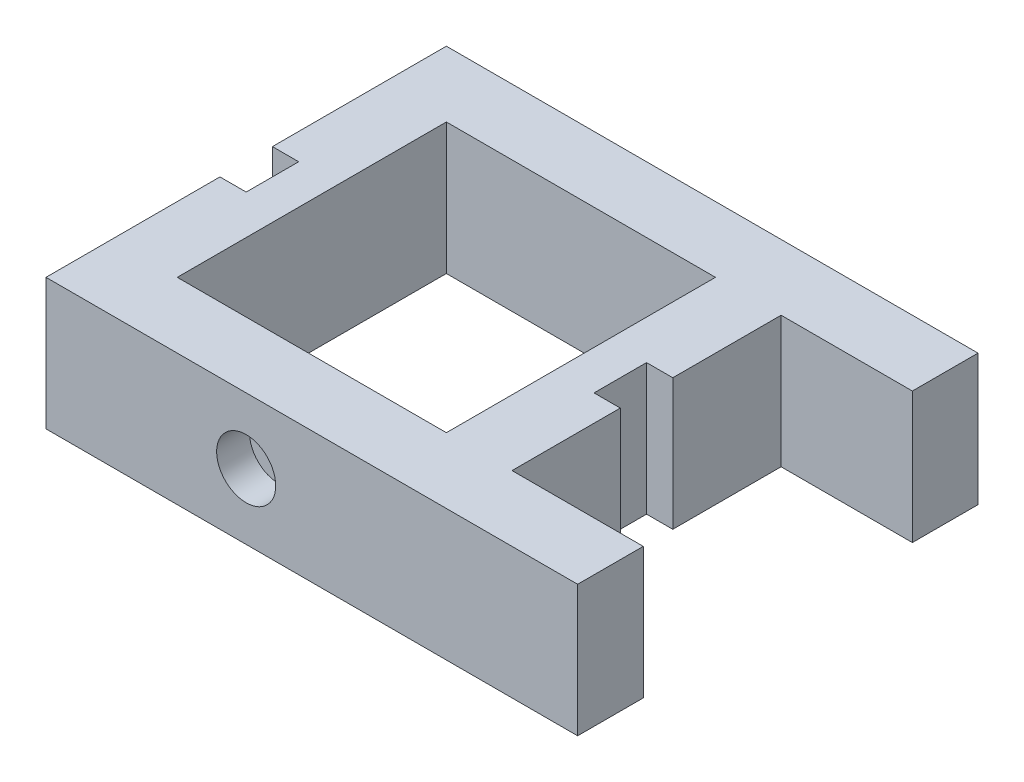
ISO-10303-21;
HEADER;
FILE_DESCRIPTION(('STEP AP214'),'2;1');
FILE_NAME('part.step','',(''),(''),'','','');
FILE_SCHEMA(('AUTOMOTIVE_DESIGN { 1 0 10303 214 1 1 1 1 }'));
ENDSEC;
DATA;
#1=APPLICATION_CONTEXT('core data for automotive mechanical design processes');
#2=APPLICATION_PROTOCOL_DEFINITION('international standard','automotive_design',2000,#1);
#3=PRODUCT_CONTEXT('',#1,'mechanical');
#4=PRODUCT('Part','Part','',(#3));
#5=PRODUCT_RELATED_PRODUCT_CATEGORY('part','',(#4));
#6=PRODUCT_DEFINITION_FORMATION('','',#4);
#7=PRODUCT_DEFINITION_CONTEXT('part definition',#1,'design');
#8=PRODUCT_DEFINITION('design','',#6,#7);
#9=PRODUCT_DEFINITION_SHAPE('','',#8);
#10=(LENGTH_UNIT() NAMED_UNIT(*) SI_UNIT(.MILLI.,.METRE.));
#11=(NAMED_UNIT(*) PLANE_ANGLE_UNIT() SI_UNIT($,.RADIAN.));
#12=(NAMED_UNIT(*) SI_UNIT($,.STERADIAN.) SOLID_ANGLE_UNIT());
#13=UNCERTAINTY_MEASURE_WITH_UNIT(LENGTH_MEASURE(1.E-05),#10,'distance_accuracy_value','');
#14=(GEOMETRIC_REPRESENTATION_CONTEXT(3) GLOBAL_UNCERTAINTY_ASSIGNED_CONTEXT((#13)) GLOBAL_UNIT_ASSIGNED_CONTEXT((#10,
#11,#12)) REPRESENTATION_CONTEXT('',''));
#15=CARTESIAN_POINT('',(0.,0.,0.));
#16=DIRECTION('',(0.,0.,1.));
#17=DIRECTION('',(1.,0.,0.));
#18=AXIS2_PLACEMENT_3D('',#15,#16,#17);
#19=CARTESIAN_POINT('',(-20.5,10.,-9.5));
#20=DIRECTION('',(0.,0.,1.));
#21=DIRECTION('',(1.,0.,0.));
#22=AXIS2_PLACEMENT_3D('',#19,#20,#21);
#23=CYLINDRICAL_SURFACE('',#22,2.5);
#24=CARTESIAN_POINT('',(-20.5,10.,20.5));
#25=DIRECTION('',(0.,0.,-1.));
#26=DIRECTION('',(-1.,0.,0.));
#27=AXIS2_PLACEMENT_3D('',#24,#25,#26);
#28=CIRCLE('',#27,2.5);
#29=CARTESIAN_POINT('',(-23.,10.,20.5));
#30=VERTEX_POINT('',#29);
#31=EDGE_CURVE('E207',#30,#30,#28,.T.);
#32=ORIENTED_EDGE('',*,*,#31,.T.);
#33=EDGE_LOOP('',(#32));
#34=FACE_BOUND('',#33,.T.);
#35=CARTESIAN_POINT('',(-20.5,10.,25.5));
#36=DIRECTION('',(0.,0.,1.));
#37=DIRECTION('',(1.,0.,0.));
#38=AXIS2_PLACEMENT_3D('',#35,#36,#37);
#39=CIRCLE('',#38,2.5);
#40=CARTESIAN_POINT('',(-18.,10.,25.5));
#41=VERTEX_POINT('',#40);
#42=EDGE_CURVE('E43',#41,#41,#39,.F.);
#43=ORIENTED_EDGE('',*,*,#42,.F.);
#44=EDGE_LOOP('',(#43));
#45=FACE_BOUND('',#44,.T.);
#46=ADVANCED_FACE('F39',(#34,#45),#23,.F.);
#47=CARTESIAN_POINT('',(0.,20.,0.));
#48=DIRECTION('',(0.,-1.,0.));
#49=DIRECTION('',(0.,0.,-1.));
#50=AXIS2_PLACEMENT_3D('',#47,#48,#49);
#51=PLANE('',#50);
#52=DIRECTION('',(0.,0.,1.));
#53=VECTOR('',#52,1.);
#54=CARTESIAN_POINT('',(-51.,20.,-30.5));
#55=LINE('',#54,#53);
#56=CARTESIAN_POINT('',(-51.,20.,-30.5));
#57=VERTEX_POINT('',#56);
#58=CARTESIAN_POINT('',(-51.,20.,-4.));
#59=VERTEX_POINT('',#58);
#60=EDGE_CURVE('E217',#57,#59,#55,.T.);
#61=ORIENTED_EDGE('',*,*,#60,.T.);
#62=DIRECTION('',(1.,0.,0.));
#63=VECTOR('',#62,1.);
#64=CARTESIAN_POINT('',(-47.,20.,-4.));
#65=LINE('',#64,#63);
#66=CARTESIAN_POINT('',(-47.,20.,-4.));
#67=VERTEX_POINT('',#66);
#68=EDGE_CURVE('E220',#59,#67,#65,.T.);
#69=ORIENTED_EDGE('',*,*,#68,.T.);
#70=DIRECTION('',(0.,0.,1.));
#71=VECTOR('',#70,1.);
#72=CARTESIAN_POINT('',(-47.,20.,-4.));
#73=LINE('',#72,#71);
#74=CARTESIAN_POINT('',(-47.,20.,4.));
#75=VERTEX_POINT('',#74);
#76=EDGE_CURVE('E223',#67,#75,#73,.T.);
#77=ORIENTED_EDGE('',*,*,#76,.T.);
#78=DIRECTION('',(-1.,0.,0.));
#79=VECTOR('',#78,1.);
#80=CARTESIAN_POINT('',(-47.,20.,4.));
#81=LINE('',#80,#79);
#82=CARTESIAN_POINT('',(-51.,20.,4.));
#83=VERTEX_POINT('',#82);
#84=EDGE_CURVE('E225',#75,#83,#81,.T.);
#85=ORIENTED_EDGE('',*,*,#84,.T.);
#86=DIRECTION('',(0.,0.,1.));
#87=VECTOR('',#86,1.);
#88=CARTESIAN_POINT('',(-51.,20.,4.));
#89=LINE('',#88,#87);
#90=CARTESIAN_POINT('',(-51.,20.,30.5));
#91=VERTEX_POINT('',#90);
#92=EDGE_CURVE('E227',#83,#91,#89,.T.);
#93=ORIENTED_EDGE('',*,*,#92,.T.);
#94=DIRECTION('',(1.,0.,0.));
#95=VECTOR('',#94,1.);
#96=CARTESIAN_POINT('',(-51.,20.,30.5));
#97=LINE('',#96,#95);
#98=CARTESIAN_POINT('',(30.,20.,30.5));
#99=VERTEX_POINT('',#98);
#100=EDGE_CURVE('E229',#91,#99,#97,.T.);
#101=ORIENTED_EDGE('',*,*,#100,.T.);
#102=DIRECTION('',(0.,0.,-1.));
#103=VECTOR('',#102,1.);
#104=CARTESIAN_POINT('',(30.,20.,20.5));
#105=LINE('',#104,#103);
#106=CARTESIAN_POINT('',(30.,20.,20.5));
#107=VERTEX_POINT('',#106);
#108=EDGE_CURVE('E231',#99,#107,#105,.T.);
#109=ORIENTED_EDGE('',*,*,#108,.T.);
#110=DIRECTION('',(-1.,0.,0.));
#111=VECTOR('',#110,1.);
#112=CARTESIAN_POINT('',(10.,20.,20.5));
#113=LINE('',#112,#111);
#114=CARTESIAN_POINT('',(10.,20.,20.5));
#115=VERTEX_POINT('',#114);
#116=EDGE_CURVE('E233',#107,#115,#113,.T.);
#117=ORIENTED_EDGE('',*,*,#116,.T.);
#118=DIRECTION('',(0.,0.,-1.));
#119=VECTOR('',#118,1.);
#120=CARTESIAN_POINT('',(10.,20.,4.));
#121=LINE('',#120,#119);
#122=CARTESIAN_POINT('',(10.,20.,4.));
#123=VERTEX_POINT('',#122);
#124=EDGE_CURVE('E235',#115,#123,#121,.T.);
#125=ORIENTED_EDGE('',*,*,#124,.T.);
#126=DIRECTION('',(-1.,0.,0.));
#127=VECTOR('',#126,1.);
#128=CARTESIAN_POINT('',(6.,20.,4.));
#129=LINE('',#128,#127);
#130=CARTESIAN_POINT('',(6.,20.,4.));
#131=VERTEX_POINT('',#130);
#132=EDGE_CURVE('E237',#123,#131,#129,.T.);
#133=ORIENTED_EDGE('',*,*,#132,.T.);
#134=DIRECTION('',(0.,0.,-1.));
#135=VECTOR('',#134,1.);
#136=CARTESIAN_POINT('',(6.,20.,-4.));
#137=LINE('',#136,#135);
#138=CARTESIAN_POINT('',(6.,20.,-4.));
#139=VERTEX_POINT('',#138);
#140=EDGE_CURVE('E239',#131,#139,#137,.T.);
#141=ORIENTED_EDGE('',*,*,#140,.T.);
#142=DIRECTION('',(1.,0.,0.));
#143=VECTOR('',#142,1.);
#144=CARTESIAN_POINT('',(6.,20.,-4.));
#145=LINE('',#144,#143);
#146=CARTESIAN_POINT('',(10.,20.,-4.));
#147=VERTEX_POINT('',#146);
#148=EDGE_CURVE('E241',#139,#147,#145,.T.);
#149=ORIENTED_EDGE('',*,*,#148,.T.);
#150=DIRECTION('',(0.,0.,-1.));
#151=VECTOR('',#150,1.);
#152=CARTESIAN_POINT('',(10.,20.,-20.5));
#153=LINE('',#152,#151);
#154=CARTESIAN_POINT('',(10.,20.,-20.5));
#155=VERTEX_POINT('',#154);
#156=EDGE_CURVE('E243',#147,#155,#153,.T.);
#157=ORIENTED_EDGE('',*,*,#156,.T.);
#158=DIRECTION('',(1.,0.,0.));
#159=VECTOR('',#158,1.);
#160=CARTESIAN_POINT('',(10.,20.,-20.5));
#161=LINE('',#160,#159);
#162=CARTESIAN_POINT('',(30.,20.,-20.5));
#163=VERTEX_POINT('',#162);
#164=EDGE_CURVE('E245',#155,#163,#161,.T.);
#165=ORIENTED_EDGE('',*,*,#164,.T.);
#166=DIRECTION('',(0.,0.,-1.));
#167=VECTOR('',#166,1.);
#168=CARTESIAN_POINT('',(30.,20.,-30.5));
#169=LINE('',#168,#167);
#170=CARTESIAN_POINT('',(30.,20.,-30.5));
#171=VERTEX_POINT('',#170);
#172=EDGE_CURVE('E247',#163,#171,#169,.T.);
#173=ORIENTED_EDGE('',*,*,#172,.T.);
#174=DIRECTION('',(-1.,0.,0.));
#175=VECTOR('',#174,1.);
#176=CARTESIAN_POINT('',(10.,20.,-30.5));
#177=LINE('',#176,#175);
#178=EDGE_CURVE('E249',#171,#57,#177,.T.);
#179=ORIENTED_EDGE('',*,*,#178,.T.);
#180=EDGE_LOOP('',(#61,#69,#77,#85,#93,#101,#109,#117,#125,#133,#141,#149,#157,#165,#173,#179));
#181=FACE_BOUND('',#180,.T.);
#182=DIRECTION('',(0.,0.,1.));
#183=VECTOR('',#182,1.);
#184=CARTESIAN_POINT('',(-41.,20.,-20.5));
#185=LINE('',#184,#183);
#186=CARTESIAN_POINT('',(-41.,20.,-20.5));
#187=VERTEX_POINT('',#186);
#188=CARTESIAN_POINT('',(-41.,20.,20.5));
#189=VERTEX_POINT('',#188);
#190=EDGE_CURVE('E178',#187,#189,#185,.T.);
#191=ORIENTED_EDGE('',*,*,#190,.F.);
#192=DIRECTION('',(-1.,0.,0.));
#193=VECTOR('',#192,1.);
#194=CARTESIAN_POINT('',(-41.,20.,-20.5));
#195=LINE('',#194,#193);
#196=CARTESIAN_POINT('',(0.,20.,-20.5));
#197=VERTEX_POINT('',#196);
#198=EDGE_CURVE('E201',#197,#187,#195,.T.);
#199=ORIENTED_EDGE('',*,*,#198,.F.);
#200=DIRECTION('',(0.,0.,-1.));
#201=VECTOR('',#200,1.);
#202=CARTESIAN_POINT('',(0.,20.,-20.5));
#203=LINE('',#202,#201);
#204=CARTESIAN_POINT('',(0.,20.,20.5));
#205=VERTEX_POINT('',#204);
#206=EDGE_CURVE('E199',#205,#197,#203,.T.);
#207=ORIENTED_EDGE('',*,*,#206,.F.);
#208=DIRECTION('',(1.,0.,0.));
#209=VECTOR('',#208,1.);
#210=CARTESIAN_POINT('',(-41.,20.,20.5));
#211=LINE('',#210,#209);
#212=EDGE_CURVE('E186',#189,#205,#211,.T.);
#213=ORIENTED_EDGE('',*,*,#212,.F.);
#214=EDGE_LOOP('',(#191,#199,#207,#213));
#215=FACE_BOUND('',#214,.T.);
#216=ADVANCED_FACE('F198',(#181,#215),#51,.F.);
#217=CARTESIAN_POINT('',(0.,0.,0.));
#218=DIRECTION('',(0.,-1.,0.));
#219=DIRECTION('',(0.,0.,-1.));
#220=AXIS2_PLACEMENT_3D('',#217,#218,#219);
#221=PLANE('',#220);
#222=DIRECTION('',(0.,0.,1.));
#223=VECTOR('',#222,1.);
#224=CARTESIAN_POINT('',(-51.,0.,-30.5));
#225=LINE('',#224,#223);
#226=CARTESIAN_POINT('',(-51.,0.,-30.5));
#227=VERTEX_POINT('',#226);
#228=CARTESIAN_POINT('',(-51.,0.,-4.));
#229=VERTEX_POINT('',#228);
#230=EDGE_CURVE('E194',#227,#229,#225,.T.);
#231=ORIENTED_EDGE('',*,*,#230,.F.);
#232=DIRECTION('',(-1.,0.,0.));
#233=VECTOR('',#232,1.);
#234=CARTESIAN_POINT('',(-51.,0.,-30.5));
#235=LINE('',#234,#233);
#236=CARTESIAN_POINT('',(30.,0.,-30.5));
#237=VERTEX_POINT('',#236);
#238=EDGE_CURVE('E221',#237,#227,#235,.T.);
#239=ORIENTED_EDGE('',*,*,#238,.F.);
#240=DIRECTION('',(0.,0.,-1.));
#241=VECTOR('',#240,1.);
#242=CARTESIAN_POINT('',(30.,0.,-30.5));
#243=LINE('',#242,#241);
#244=CARTESIAN_POINT('',(30.,0.,-20.5));
#245=VERTEX_POINT('',#244);
#246=EDGE_CURVE('E281',#245,#237,#243,.T.);
#247=ORIENTED_EDGE('',*,*,#246,.F.);
#248=DIRECTION('',(1.,0.,0.));
#249=VECTOR('',#248,1.);
#250=CARTESIAN_POINT('',(10.,0.,-20.5));
#251=LINE('',#250,#249);
#252=CARTESIAN_POINT('',(10.,0.,-20.5));
#253=VERTEX_POINT('',#252);
#254=EDGE_CURVE('E279',#253,#245,#251,.T.);
#255=ORIENTED_EDGE('',*,*,#254,.F.);
#256=DIRECTION('',(0.,0.,-1.));
#257=VECTOR('',#256,1.);
#258=CARTESIAN_POINT('',(10.,0.,-20.5));
#259=LINE('',#258,#257);
#260=CARTESIAN_POINT('',(10.,0.,-4.));
#261=VERTEX_POINT('',#260);
#262=EDGE_CURVE('E277',#261,#253,#259,.T.);
#263=ORIENTED_EDGE('',*,*,#262,.F.);
#264=DIRECTION('',(1.,0.,0.));
#265=VECTOR('',#264,1.);
#266=CARTESIAN_POINT('',(6.,0.,-4.));
#267=LINE('',#266,#265);
#268=CARTESIAN_POINT('',(6.,0.,-4.));
#269=VERTEX_POINT('',#268);
#270=EDGE_CURVE('E275',#269,#261,#267,.T.);
#271=ORIENTED_EDGE('',*,*,#270,.F.);
#272=DIRECTION('',(0.,0.,-1.));
#273=VECTOR('',#272,1.);
#274=CARTESIAN_POINT('',(6.,0.,-4.));
#275=LINE('',#274,#273);
#276=CARTESIAN_POINT('',(6.,0.,4.));
#277=VERTEX_POINT('',#276);
#278=EDGE_CURVE('E273',#277,#269,#275,.T.);
#279=ORIENTED_EDGE('',*,*,#278,.F.);
#280=DIRECTION('',(-1.,0.,0.));
#281=VECTOR('',#280,1.);
#282=CARTESIAN_POINT('',(6.,0.,4.));
#283=LINE('',#282,#281);
#284=CARTESIAN_POINT('',(10.,0.,4.));
#285=VERTEX_POINT('',#284);
#286=EDGE_CURVE('E271',#285,#277,#283,.T.);
#287=ORIENTED_EDGE('',*,*,#286,.F.);
#288=DIRECTION('',(0.,0.,-1.));
#289=VECTOR('',#288,1.);
#290=CARTESIAN_POINT('',(10.,0.,4.));
#291=LINE('',#290,#289);
#292=CARTESIAN_POINT('',(10.,0.,20.5));
#293=VERTEX_POINT('',#292);
#294=EDGE_CURVE('E269',#293,#285,#291,.T.);
#295=ORIENTED_EDGE('',*,*,#294,.F.);
#296=DIRECTION('',(-1.,0.,0.));
#297=VECTOR('',#296,1.);
#298=CARTESIAN_POINT('',(10.,0.,20.5));
#299=LINE('',#298,#297);
#300=CARTESIAN_POINT('',(30.,0.,20.5));
#301=VERTEX_POINT('',#300);
#302=EDGE_CURVE('E267',#301,#293,#299,.T.);
#303=ORIENTED_EDGE('',*,*,#302,.F.);
#304=DIRECTION('',(0.,0.,-1.));
#305=VECTOR('',#304,1.);
#306=CARTESIAN_POINT('',(30.,0.,20.5));
#307=LINE('',#306,#305);
#308=CARTESIAN_POINT('',(30.,0.,30.5));
#309=VERTEX_POINT('',#308);
#310=EDGE_CURVE('E265',#309,#301,#307,.T.);
#311=ORIENTED_EDGE('',*,*,#310,.F.);
#312=DIRECTION('',(1.,0.,0.));
#313=VECTOR('',#312,1.);
#314=CARTESIAN_POINT('',(10.,0.,30.5));
#315=LINE('',#314,#313);
#316=CARTESIAN_POINT('',(-51.,0.,30.5));
#317=VERTEX_POINT('',#316);
#318=EDGE_CURVE('E263',#317,#309,#315,.T.);
#319=ORIENTED_EDGE('',*,*,#318,.F.);
#320=DIRECTION('',(0.,0.,1.));
#321=VECTOR('',#320,1.);
#322=CARTESIAN_POINT('',(-51.,0.,4.));
#323=LINE('',#322,#321);
#324=CARTESIAN_POINT('',(-51.,0.,4.));
#325=VERTEX_POINT('',#324);
#326=EDGE_CURVE('E260',#325,#317,#323,.T.);
#327=ORIENTED_EDGE('',*,*,#326,.F.);
#328=DIRECTION('',(-1.,0.,0.));
#329=VECTOR('',#328,1.);
#330=CARTESIAN_POINT('',(-47.,0.,4.));
#331=LINE('',#330,#329);
#332=CARTESIAN_POINT('',(-47.,0.,4.));
#333=VERTEX_POINT('',#332);
#334=EDGE_CURVE('E258',#333,#325,#331,.T.);
#335=ORIENTED_EDGE('',*,*,#334,.F.);
#336=DIRECTION('',(0.,0.,1.));
#337=VECTOR('',#336,1.);
#338=CARTESIAN_POINT('',(-47.,0.,-4.));
#339=LINE('',#338,#337);
#340=CARTESIAN_POINT('',(-47.,0.,-4.));
#341=VERTEX_POINT('',#340);
#342=EDGE_CURVE('E256',#341,#333,#339,.T.);
#343=ORIENTED_EDGE('',*,*,#342,.F.);
#344=DIRECTION('',(1.,0.,0.));
#345=VECTOR('',#344,1.);
#346=CARTESIAN_POINT('',(-47.,0.,-4.));
#347=LINE('',#346,#345);
#348=EDGE_CURVE('E254',#229,#341,#347,.T.);
#349=ORIENTED_EDGE('',*,*,#348,.F.);
#350=EDGE_LOOP('',(#231,#239,#247,#255,#263,#271,#279,#287,#295,#303,#311,#319,#327,#335,#343,#349));
#351=FACE_BOUND('',#350,.T.);
#352=DIRECTION('',(-1.,0.,0.));
#353=VECTOR('',#352,1.);
#354=CARTESIAN_POINT('',(-41.,0.,-20.5));
#355=LINE('',#354,#353);
#356=CARTESIAN_POINT('',(0.,0.,-20.5));
#357=VERTEX_POINT('',#356);
#358=CARTESIAN_POINT('',(-41.,0.,-20.5));
#359=VERTEX_POINT('',#358);
#360=EDGE_CURVE('E187',#357,#359,#355,.T.);
#361=ORIENTED_EDGE('',*,*,#360,.T.);
#362=DIRECTION('',(0.,0.,1.));
#363=VECTOR('',#362,1.);
#364=CARTESIAN_POINT('',(-41.,0.,-20.5));
#365=LINE('',#364,#363);
#366=CARTESIAN_POINT('',(-41.,0.,20.5));
#367=VERTEX_POINT('',#366);
#368=EDGE_CURVE('E64',#359,#367,#365,.T.);
#369=ORIENTED_EDGE('',*,*,#368,.T.);
#370=DIRECTION('',(1.,0.,0.));
#371=VECTOR('',#370,1.);
#372=CARTESIAN_POINT('',(-41.,0.,20.5));
#373=LINE('',#372,#371);
#374=CARTESIAN_POINT('',(0.,0.,20.5));
#375=VERTEX_POINT('',#374);
#376=EDGE_CURVE('E193',#367,#375,#373,.T.);
#377=ORIENTED_EDGE('',*,*,#376,.T.);
#378=DIRECTION('',(0.,0.,-1.));
#379=VECTOR('',#378,1.);
#380=CARTESIAN_POINT('',(0.,0.,-20.5));
#381=LINE('',#380,#379);
#382=EDGE_CURVE('E209',#375,#357,#381,.T.);
#383=ORIENTED_EDGE('',*,*,#382,.T.);
#384=EDGE_LOOP('',(#361,#369,#377,#383));
#385=FACE_BOUND('',#384,.T.);
#386=ADVANCED_FACE('F361',(#351,#385),#221,.T.);
#387=CARTESIAN_POINT('',(-51.,20.,-30.5));
#388=DIRECTION('',(1.,0.,0.));
#389=DIRECTION('',(0.,0.,-1.));
#390=AXIS2_PLACEMENT_3D('',#387,#388,#389);
#391=PLANE('',#390);
#392=ORIENTED_EDGE('',*,*,#230,.T.);
#393=DIRECTION('',(0.,-1.,0.));
#394=VECTOR('',#393,1.);
#395=CARTESIAN_POINT('',(-51.,20.,-4.));
#396=LINE('',#395,#394);
#397=EDGE_CURVE('E11',#59,#229,#396,.T.);
#398=ORIENTED_EDGE('',*,*,#397,.F.);
#399=ORIENTED_EDGE('',*,*,#60,.F.);
#400=DIRECTION('',(0.,-1.,0.));
#401=VECTOR('',#400,1.);
#402=CARTESIAN_POINT('',(-51.,20.,-30.5));
#403=LINE('',#402,#401);
#404=EDGE_CURVE('E251',#57,#227,#403,.T.);
#405=ORIENTED_EDGE('',*,*,#404,.T.);
#406=EDGE_LOOP('',(#392,#398,#399,#405));
#407=FACE_BOUND('',#406,.T.);
#408=ADVANCED_FACE('F41',(#407),#391,.F.);
#409=CARTESIAN_POINT('',(-47.,20.,-4.));
#410=DIRECTION('',(0.,0.,-1.));
#411=DIRECTION('',(-1.,0.,0.));
#412=AXIS2_PLACEMENT_3D('',#409,#410,#411);
#413=PLANE('',#412);
#414=ORIENTED_EDGE('',*,*,#348,.T.);
#415=DIRECTION('',(0.,-1.,0.));
#416=VECTOR('',#415,1.);
#417=CARTESIAN_POINT('',(-47.,20.,-4.));
#418=LINE('',#417,#416);
#419=EDGE_CURVE('E48',#67,#341,#418,.T.);
#420=ORIENTED_EDGE('',*,*,#419,.F.);
#421=ORIENTED_EDGE('',*,*,#68,.F.);
#422=ORIENTED_EDGE('',*,*,#397,.T.);
#423=EDGE_LOOP('',(#414,#420,#421,#422));
#424=FACE_BOUND('',#423,.T.);
#425=ADVANCED_FACE('F390',(#424),#413,.F.);
#426=CARTESIAN_POINT('',(-47.,20.,-4.));
#427=DIRECTION('',(1.,0.,0.));
#428=DIRECTION('',(0.,0.,-1.));
#429=AXIS2_PLACEMENT_3D('',#426,#427,#428);
#430=PLANE('',#429);
#431=ORIENTED_EDGE('',*,*,#342,.T.);
#432=DIRECTION('',(0.,-1.,0.));
#433=VECTOR('',#432,1.);
#434=CARTESIAN_POINT('',(-47.,20.,4.));
#435=LINE('',#434,#433);
#436=EDGE_CURVE('E323',#75,#333,#435,.T.);
#437=ORIENTED_EDGE('',*,*,#436,.F.);
#438=ORIENTED_EDGE('',*,*,#76,.F.);
#439=ORIENTED_EDGE('',*,*,#419,.T.);
#440=EDGE_LOOP('',(#431,#437,#438,#439));
#441=FACE_BOUND('',#440,.T.);
#442=ADVANCED_FACE('F387',(#441),#430,.F.);
#443=CARTESIAN_POINT('',(-47.,20.,4.));
#444=DIRECTION('',(0.,0.,1.));
#445=DIRECTION('',(1.,0.,0.));
#446=AXIS2_PLACEMENT_3D('',#443,#444,#445);
#447=PLANE('',#446);
#448=ORIENTED_EDGE('',*,*,#334,.T.);
#449=DIRECTION('',(0.,-1.,0.));
#450=VECTOR('',#449,1.);
#451=CARTESIAN_POINT('',(-51.,20.,4.));
#452=LINE('',#451,#450);
#453=EDGE_CURVE('E320',#83,#325,#452,.T.);
#454=ORIENTED_EDGE('',*,*,#453,.F.);
#455=ORIENTED_EDGE('',*,*,#84,.F.);
#456=ORIENTED_EDGE('',*,*,#436,.T.);
#457=EDGE_LOOP('',(#448,#454,#455,#456));
#458=FACE_BOUND('',#457,.T.);
#459=ADVANCED_FACE('F383',(#458),#447,.F.);
#460=CARTESIAN_POINT('',(-51.,20.,4.));
#461=DIRECTION('',(1.,0.,0.));
#462=DIRECTION('',(0.,0.,-1.));
#463=AXIS2_PLACEMENT_3D('',#460,#461,#462);
#464=PLANE('',#463);
#465=ORIENTED_EDGE('',*,*,#326,.T.);
#466=DIRECTION('',(0.,-1.,0.));
#467=VECTOR('',#466,1.);
#468=CARTESIAN_POINT('',(-51.,20.,30.5));
#469=LINE('',#468,#467);
#470=EDGE_CURVE('E317',#91,#317,#469,.T.);
#471=ORIENTED_EDGE('',*,*,#470,.F.);
#472=ORIENTED_EDGE('',*,*,#92,.F.);
#473=ORIENTED_EDGE('',*,*,#453,.T.);
#474=EDGE_LOOP('',(#465,#471,#472,#473));
#475=FACE_BOUND('',#474,.T.);
#476=ADVANCED_FACE('F348',(#475),#464,.F.);
#477=CARTESIAN_POINT('',(10.,20.,30.5));
#478=DIRECTION('',(0.,0.,-1.));
#479=DIRECTION('',(-1.,0.,0.));
#480=AXIS2_PLACEMENT_3D('',#477,#478,#479);
#481=PLANE('',#480);
#482=CARTESIAN_POINT('',(-20.5,10.,30.5));
#483=DIRECTION('',(0.,0.,1.));
#484=DIRECTION('',(1.,0.,0.));
#485=AXIS2_PLACEMENT_3D('',#482,#483,#484);
#486=CIRCLE('',#485,4.5);
#487=CARTESIAN_POINT('',(-16.,10.,30.5));
#488=VERTEX_POINT('',#487);
#489=EDGE_CURVE('E335',#488,#488,#486,.T.);
#490=ORIENTED_EDGE('',*,*,#489,.F.);
#491=EDGE_LOOP('',(#490));
#492=FACE_BOUND('',#491,.T.);
#493=ORIENTED_EDGE('',*,*,#318,.T.);
#494=DIRECTION('',(0.,-1.,0.));
#495=VECTOR('',#494,1.);
#496=CARTESIAN_POINT('',(30.,20.,30.5));
#497=LINE('',#496,#495);
#498=EDGE_CURVE('E314',#99,#309,#497,.T.);
#499=ORIENTED_EDGE('',*,*,#498,.F.);
#500=ORIENTED_EDGE('',*,*,#100,.F.);
#501=ORIENTED_EDGE('',*,*,#470,.T.);
#502=EDGE_LOOP('',(#493,#499,#500,#501));
#503=FACE_BOUND('',#502,.T.);
#504=ADVANCED_FACE('F344',(#492,#503),#481,.F.);
#505=CARTESIAN_POINT('',(30.,20.,20.5));
#506=DIRECTION('',(-1.,0.,0.));
#507=DIRECTION('',(0.,0.,1.));
#508=AXIS2_PLACEMENT_3D('',#505,#506,#507);
#509=PLANE('',#508);
#510=ORIENTED_EDGE('',*,*,#310,.T.);
#511=DIRECTION('',(0.,-1.,0.));
#512=VECTOR('',#511,1.);
#513=CARTESIAN_POINT('',(30.,20.,20.5));
#514=LINE('',#513,#512);
#515=EDGE_CURVE('E311',#107,#301,#514,.T.);
#516=ORIENTED_EDGE('',*,*,#515,.F.);
#517=ORIENTED_EDGE('',*,*,#108,.F.);
#518=ORIENTED_EDGE('',*,*,#498,.T.);
#519=EDGE_LOOP('',(#510,#516,#517,#518));
#520=FACE_BOUND('',#519,.T.);
#521=ADVANCED_FACE('F347',(#520),#509,.F.);
#522=CARTESIAN_POINT('',(10.,20.,20.5));
#523=DIRECTION('',(0.,0.,1.));
#524=DIRECTION('',(1.,0.,0.));
#525=AXIS2_PLACEMENT_3D('',#522,#523,#524);
#526=PLANE('',#525);
#527=ORIENTED_EDGE('',*,*,#302,.T.);
#528=DIRECTION('',(0.,-1.,0.));
#529=VECTOR('',#528,1.);
#530=CARTESIAN_POINT('',(10.,20.,20.5));
#531=LINE('',#530,#529);
#532=EDGE_CURVE('E308',#115,#293,#531,.T.);
#533=ORIENTED_EDGE('',*,*,#532,.F.);
#534=ORIENTED_EDGE('',*,*,#116,.F.);
#535=ORIENTED_EDGE('',*,*,#515,.T.);
#536=EDGE_LOOP('',(#527,#533,#534,#535));
#537=FACE_BOUND('',#536,.T.);
#538=ADVANCED_FACE('F367',(#537),#526,.F.);
#539=CARTESIAN_POINT('',(10.,20.,4.));
#540=DIRECTION('',(-1.,0.,0.));
#541=DIRECTION('',(0.,0.,1.));
#542=AXIS2_PLACEMENT_3D('',#539,#540,#541);
#543=PLANE('',#542);
#544=ORIENTED_EDGE('',*,*,#294,.T.);
#545=DIRECTION('',(0.,-1.,0.));
#546=VECTOR('',#545,1.);
#547=CARTESIAN_POINT('',(10.,20.,4.));
#548=LINE('',#547,#546);
#549=EDGE_CURVE('E305',#123,#285,#548,.T.);
#550=ORIENTED_EDGE('',*,*,#549,.F.);
#551=ORIENTED_EDGE('',*,*,#124,.F.);
#552=ORIENTED_EDGE('',*,*,#532,.T.);
#553=EDGE_LOOP('',(#544,#550,#551,#552));
#554=FACE_BOUND('',#553,.T.);
#555=ADVANCED_FACE('F371',(#554),#543,.F.);
#556=CARTESIAN_POINT('',(6.,20.,4.));
#557=DIRECTION('',(0.,0.,1.));
#558=DIRECTION('',(1.,0.,0.));
#559=AXIS2_PLACEMENT_3D('',#556,#557,#558);
#560=PLANE('',#559);
#561=ORIENTED_EDGE('',*,*,#286,.T.);
#562=DIRECTION('',(0.,-1.,0.));
#563=VECTOR('',#562,1.);
#564=CARTESIAN_POINT('',(6.,20.,4.));
#565=LINE('',#564,#563);
#566=EDGE_CURVE('E302',#131,#277,#565,.T.);
#567=ORIENTED_EDGE('',*,*,#566,.F.);
#568=ORIENTED_EDGE('',*,*,#132,.F.);
#569=ORIENTED_EDGE('',*,*,#549,.T.);
#570=EDGE_LOOP('',(#561,#567,#568,#569));
#571=FACE_BOUND('',#570,.T.);
#572=ADVANCED_FACE('F424',(#571),#560,.F.);
#573=CARTESIAN_POINT('',(6.,20.,-4.));
#574=DIRECTION('',(-1.,0.,0.));
#575=DIRECTION('',(0.,0.,1.));
#576=AXIS2_PLACEMENT_3D('',#573,#574,#575);
#577=PLANE('',#576);
#578=ORIENTED_EDGE('',*,*,#278,.T.);
#579=DIRECTION('',(0.,-1.,0.));
#580=VECTOR('',#579,1.);
#581=CARTESIAN_POINT('',(6.,20.,-4.));
#582=LINE('',#581,#580);
#583=EDGE_CURVE('E299',#139,#269,#582,.T.);
#584=ORIENTED_EDGE('',*,*,#583,.F.);
#585=ORIENTED_EDGE('',*,*,#140,.F.);
#586=ORIENTED_EDGE('',*,*,#566,.T.);
#587=EDGE_LOOP('',(#578,#584,#585,#586));
#588=FACE_BOUND('',#587,.T.);
#589=ADVANCED_FACE('F421',(#588),#577,.F.);
#590=CARTESIAN_POINT('',(6.,20.,-4.));
#591=DIRECTION('',(0.,0.,-1.));
#592=DIRECTION('',(-1.,0.,0.));
#593=AXIS2_PLACEMENT_3D('',#590,#591,#592);
#594=PLANE('',#593);
#595=ORIENTED_EDGE('',*,*,#270,.T.);
#596=DIRECTION('',(0.,-1.,0.));
#597=VECTOR('',#596,1.);
#598=CARTESIAN_POINT('',(10.,20.,-4.));
#599=LINE('',#598,#597);
#600=EDGE_CURVE('E296',#147,#261,#599,.T.);
#601=ORIENTED_EDGE('',*,*,#600,.F.);
#602=ORIENTED_EDGE('',*,*,#148,.F.);
#603=ORIENTED_EDGE('',*,*,#583,.T.);
#604=EDGE_LOOP('',(#595,#601,#602,#603));
#605=FACE_BOUND('',#604,.T.);
#606=ADVANCED_FACE('F417',(#605),#594,.F.);
#607=CARTESIAN_POINT('',(10.,20.,-20.5));
#608=DIRECTION('',(-1.,0.,0.));
#609=DIRECTION('',(0.,0.,1.));
#610=AXIS2_PLACEMENT_3D('',#607,#608,#609);
#611=PLANE('',#610);
#612=ORIENTED_EDGE('',*,*,#262,.T.);
#613=DIRECTION('',(0.,-1.,0.));
#614=VECTOR('',#613,1.);
#615=CARTESIAN_POINT('',(10.,20.,-20.5));
#616=LINE('',#615,#614);
#617=EDGE_CURVE('E293',#155,#253,#616,.T.);
#618=ORIENTED_EDGE('',*,*,#617,.F.);
#619=ORIENTED_EDGE('',*,*,#156,.F.);
#620=ORIENTED_EDGE('',*,*,#600,.T.);
#621=EDGE_LOOP('',(#612,#618,#619,#620));
#622=FACE_BOUND('',#621,.T.);
#623=ADVANCED_FACE('F413',(#622),#611,.F.);
#624=CARTESIAN_POINT('',(10.,20.,-20.5));
#625=DIRECTION('',(0.,0.,-1.));
#626=DIRECTION('',(-1.,0.,0.));
#627=AXIS2_PLACEMENT_3D('',#624,#625,#626);
#628=PLANE('',#627);
#629=ORIENTED_EDGE('',*,*,#254,.T.);
#630=DIRECTION('',(0.,-1.,0.));
#631=VECTOR('',#630,1.);
#632=CARTESIAN_POINT('',(30.,20.,-20.5));
#633=LINE('',#632,#631);
#634=EDGE_CURVE('E290',#163,#245,#633,.T.);
#635=ORIENTED_EDGE('',*,*,#634,.F.);
#636=ORIENTED_EDGE('',*,*,#164,.F.);
#637=ORIENTED_EDGE('',*,*,#617,.T.);
#638=EDGE_LOOP('',(#629,#635,#636,#637));
#639=FACE_BOUND('',#638,.T.);
#640=ADVANCED_FACE('F408',(#639),#628,.F.);
#641=CARTESIAN_POINT('',(30.,20.,-30.5));
#642=DIRECTION('',(-1.,0.,0.));
#643=DIRECTION('',(0.,0.,1.));
#644=AXIS2_PLACEMENT_3D('',#641,#642,#643);
#645=PLANE('',#644);
#646=ORIENTED_EDGE('',*,*,#246,.T.);
#647=DIRECTION('',(0.,-1.,0.));
#648=VECTOR('',#647,1.);
#649=CARTESIAN_POINT('',(30.,20.,-30.5));
#650=LINE('',#649,#648);
#651=EDGE_CURVE('E287',#171,#237,#650,.T.);
#652=ORIENTED_EDGE('',*,*,#651,.F.);
#653=ORIENTED_EDGE('',*,*,#172,.F.);
#654=ORIENTED_EDGE('',*,*,#634,.T.);
#655=EDGE_LOOP('',(#646,#652,#653,#654));
#656=FACE_BOUND('',#655,.T.);
#657=ADVANCED_FACE('F402',(#656),#645,.F.);
#658=CARTESIAN_POINT('',(-51.,20.,-30.5));
#659=DIRECTION('',(0.,0.,1.));
#660=DIRECTION('',(1.,0.,0.));
#661=AXIS2_PLACEMENT_3D('',#658,#659,#660);
#662=PLANE('',#661);
#663=ORIENTED_EDGE('',*,*,#238,.T.);
#664=ORIENTED_EDGE('',*,*,#404,.F.);
#665=ORIENTED_EDGE('',*,*,#178,.F.);
#666=ORIENTED_EDGE('',*,*,#651,.T.);
#667=EDGE_LOOP('',(#663,#664,#665,#666));
#668=FACE_BOUND('',#667,.T.);
#669=ADVANCED_FACE('F398',(#668),#662,.F.);
#670=CARTESIAN_POINT('',(-41.,20.,-20.5));
#671=DIRECTION('',(1.,0.,0.));
#672=DIRECTION('',(0.,0.,-1.));
#673=AXIS2_PLACEMENT_3D('',#670,#671,#672);
#674=PLANE('',#673);
#675=ORIENTED_EDGE('',*,*,#368,.F.);
#676=DIRECTION('',(0.,-1.,0.));
#677=VECTOR('',#676,1.);
#678=CARTESIAN_POINT('',(-41.,20.,-20.5));
#679=LINE('',#678,#677);
#680=EDGE_CURVE('E182',#187,#359,#679,.T.);
#681=ORIENTED_EDGE('',*,*,#680,.F.);
#682=ORIENTED_EDGE('',*,*,#190,.T.);
#683=DIRECTION('',(0.,-1.,0.));
#684=VECTOR('',#683,1.);
#685=CARTESIAN_POINT('',(-41.,20.,20.5));
#686=LINE('',#685,#684);
#687=EDGE_CURVE('E181',#189,#367,#686,.T.);
#688=ORIENTED_EDGE('',*,*,#687,.T.);
#689=EDGE_LOOP('',(#675,#681,#682,#688));
#690=FACE_BOUND('',#689,.T.);
#691=ADVANCED_FACE('F180',(#690),#674,.T.);
#692=CARTESIAN_POINT('',(-41.,20.,20.5));
#693=DIRECTION('',(0.,0.,-1.));
#694=DIRECTION('',(-1.,0.,0.));
#695=AXIS2_PLACEMENT_3D('',#692,#693,#694);
#696=PLANE('',#695);
#697=ORIENTED_EDGE('',*,*,#31,.F.);
#698=EDGE_LOOP('',(#697));
#699=FACE_BOUND('',#698,.T.);
#700=ORIENTED_EDGE('',*,*,#376,.F.);
#701=ORIENTED_EDGE('',*,*,#687,.F.);
#702=ORIENTED_EDGE('',*,*,#212,.T.);
#703=DIRECTION('',(0.,-1.,0.));
#704=VECTOR('',#703,1.);
#705=CARTESIAN_POINT('',(0.,20.,20.5));
#706=LINE('',#705,#704);
#707=EDGE_CURVE('E195',#205,#375,#706,.T.);
#708=ORIENTED_EDGE('',*,*,#707,.T.);
#709=EDGE_LOOP('',(#700,#701,#702,#708));
#710=FACE_BOUND('',#709,.T.);
#711=ADVANCED_FACE('F190',(#699,#710),#696,.T.);
#712=CARTESIAN_POINT('',(0.,20.,-20.5));
#713=DIRECTION('',(-1.,0.,0.));
#714=DIRECTION('',(0.,0.,1.));
#715=AXIS2_PLACEMENT_3D('',#712,#713,#714);
#716=PLANE('',#715);
#717=ORIENTED_EDGE('',*,*,#382,.F.);
#718=ORIENTED_EDGE('',*,*,#707,.F.);
#719=ORIENTED_EDGE('',*,*,#206,.T.);
#720=DIRECTION('',(0.,-1.,0.));
#721=VECTOR('',#720,1.);
#722=CARTESIAN_POINT('',(0.,20.,-20.5));
#723=LINE('',#722,#721);
#724=EDGE_CURVE('E56',#197,#357,#723,.T.);
#725=ORIENTED_EDGE('',*,*,#724,.T.);
#726=EDGE_LOOP('',(#717,#718,#719,#725));
#727=FACE_BOUND('',#726,.T.);
#728=ADVANCED_FACE('F448',(#727),#716,.T.);
#729=CARTESIAN_POINT('',(-41.,20.,-20.5));
#730=DIRECTION('',(0.,0.,1.));
#731=DIRECTION('',(1.,0.,0.));
#732=AXIS2_PLACEMENT_3D('',#729,#730,#731);
#733=PLANE('',#732);
#734=ORIENTED_EDGE('',*,*,#360,.F.);
#735=ORIENTED_EDGE('',*,*,#724,.F.);
#736=ORIENTED_EDGE('',*,*,#198,.T.);
#737=ORIENTED_EDGE('',*,*,#680,.T.);
#738=EDGE_LOOP('',(#734,#735,#736,#737));
#739=FACE_BOUND('',#738,.T.);
#740=ADVANCED_FACE('F444',(#739),#733,.T.);
#741=CARTESIAN_POINT('',(-20.5,10.,25.5));
#742=DIRECTION('',(0.,0.,1.));
#743=DIRECTION('',(1.,0.,0.));
#744=AXIS2_PLACEMENT_3D('',#741,#742,#743);
#745=PLANE('',#744);
#746=CARTESIAN_POINT('',(-20.5,10.,25.5));
#747=DIRECTION('',(0.,0.,1.));
#748=DIRECTION('',(1.,0.,0.));
#749=AXIS2_PLACEMENT_3D('',#746,#747,#748);
#750=CIRCLE('',#749,4.5);
#751=CARTESIAN_POINT('',(-16.,10.,25.5));
#752=VERTEX_POINT('',#751);
#753=EDGE_CURVE('E331',#752,#752,#750,.T.);
#754=ORIENTED_EDGE('',*,*,#753,.T.);
#755=EDGE_LOOP('',(#754));
#756=FACE_BOUND('',#755,.T.);
#757=ORIENTED_EDGE('',*,*,#42,.T.);
#758=EDGE_LOOP('',(#757));
#759=FACE_BOUND('',#758,.T.);
#760=ADVANCED_FACE('F447',(#756,#759),#745,.T.);
#761=CARTESIAN_POINT('',(-20.5,10.,25.5));
#762=DIRECTION('',(0.,0.,1.));
#763=DIRECTION('',(1.,0.,0.));
#764=AXIS2_PLACEMENT_3D('',#761,#762,#763);
#765=CYLINDRICAL_SURFACE('',#764,4.5);
#766=ORIENTED_EDGE('',*,*,#753,.F.);
#767=EDGE_LOOP('',(#766));
#768=FACE_BOUND('',#767,.T.);
#769=ORIENTED_EDGE('',*,*,#489,.T.);
#770=EDGE_LOOP('',(#769));
#771=FACE_BOUND('',#770,.T.);
#772=ADVANCED_FACE('F342',(#768,#771),#765,.F.);
#773=CLOSED_SHELL('',(#46,#216,#386,#408,#425,#442,#459,#476,#504,#521,#538,#555,#572,#589,#606,
#623,#640,#657,#669,#691,#711,#728,#740,#760,#772));
#774=MANIFOLD_SOLID_BREP('B2',#773);
#775=ADVANCED_BREP_SHAPE_REPRESENTATION('',(#18,#774),#14);
#776=SHAPE_DEFINITION_REPRESENTATION(#9,#775);
ENDSEC;
END-ISO-10303-21;
